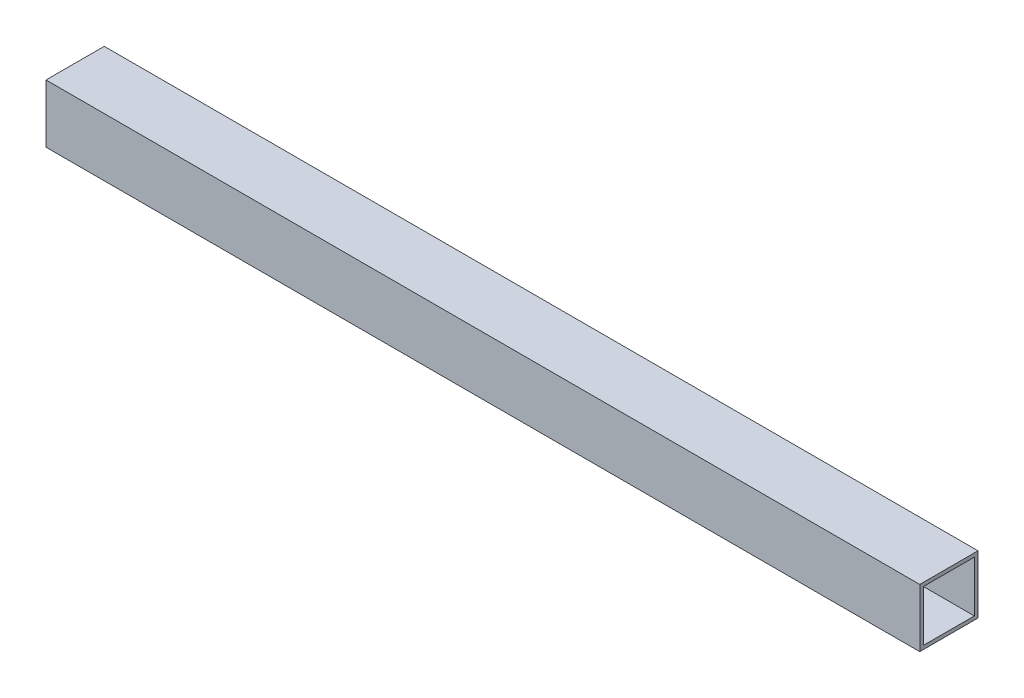
ISO-10303-21;
HEADER;
FILE_DESCRIPTION(('STEP AP214'),'2;1');
FILE_NAME('part.step','',(''),(''),'','','');
FILE_SCHEMA(('AUTOMOTIVE_DESIGN { 1 0 10303 214 1 1 1 1 }'));
ENDSEC;
DATA;
#1=APPLICATION_CONTEXT('core data for automotive mechanical design processes');
#2=APPLICATION_PROTOCOL_DEFINITION('international standard','automotive_design',2000,#1);
#3=PRODUCT_CONTEXT('',#1,'mechanical');
#4=PRODUCT('Part','Part','',(#3));
#5=PRODUCT_RELATED_PRODUCT_CATEGORY('part','',(#4));
#6=PRODUCT_DEFINITION_FORMATION('','',#4);
#7=PRODUCT_DEFINITION_CONTEXT('part definition',#1,'design');
#8=PRODUCT_DEFINITION('design','',#6,#7);
#9=PRODUCT_DEFINITION_SHAPE('','',#8);
#10=(LENGTH_UNIT() NAMED_UNIT(*) SI_UNIT(.MILLI.,.METRE.));
#11=(NAMED_UNIT(*) PLANE_ANGLE_UNIT() SI_UNIT($,.RADIAN.));
#12=(NAMED_UNIT(*) SI_UNIT($,.STERADIAN.) SOLID_ANGLE_UNIT());
#13=UNCERTAINTY_MEASURE_WITH_UNIT(LENGTH_MEASURE(1.E-05),#10,'distance_accuracy_value','');
#14=(GEOMETRIC_REPRESENTATION_CONTEXT(3) GLOBAL_UNCERTAINTY_ASSIGNED_CONTEXT((#13)) GLOBAL_UNIT_ASSIGNED_CONTEXT((#10,
#11,#12)) REPRESENTATION_CONTEXT('',''));
#15=CARTESIAN_POINT('',(0.,0.,0.));
#16=DIRECTION('',(0.,0.,1.));
#17=DIRECTION('',(1.,0.,0.));
#18=AXIS2_PLACEMENT_3D('',#15,#16,#17);
#19=CARTESIAN_POINT('',(381.,0.,0.));
#20=DIRECTION('',(1.,0.,0.));
#21=DIRECTION('',(0.,0.,-1.));
#22=AXIS2_PLACEMENT_3D('',#19,#20,#21);
#23=PLANE('',#22);
#24=DIRECTION('',(0.,1.,0.));
#25=VECTOR('',#24,1.);
#26=CARTESIAN_POINT('',(381.,-12.7,-12.7));
#27=LINE('',#26,#25);
#28=CARTESIAN_POINT('',(381.,-12.7,-12.7));
#29=VERTEX_POINT('',#28);
#30=CARTESIAN_POINT('',(381.,12.7,-12.7));
#31=VERTEX_POINT('',#30);
#32=EDGE_CURVE('E166',#29,#31,#27,.T.);
#33=ORIENTED_EDGE('',*,*,#32,.T.);
#34=DIRECTION('',(0.,0.,1.));
#35=VECTOR('',#34,1.);
#36=CARTESIAN_POINT('',(381.,12.7,12.7));
#37=LINE('',#36,#35);
#38=CARTESIAN_POINT('',(381.,12.7,12.7));
#39=VERTEX_POINT('',#38);
#40=EDGE_CURVE('E169',#31,#39,#37,.T.);
#41=ORIENTED_EDGE('',*,*,#40,.T.);
#42=DIRECTION('',(0.,-1.,0.));
#43=VECTOR('',#42,1.);
#44=CARTESIAN_POINT('',(381.,-12.7,12.7));
#45=LINE('',#44,#43);
#46=CARTESIAN_POINT('',(381.,-12.7,12.7));
#47=VERTEX_POINT('',#46);
#48=EDGE_CURVE('E172',#39,#47,#45,.T.);
#49=ORIENTED_EDGE('',*,*,#48,.T.);
#50=DIRECTION('',(0.,0.,-1.));
#51=VECTOR('',#50,1.);
#52=CARTESIAN_POINT('',(381.,-12.7,12.7));
#53=LINE('',#52,#51);
#54=EDGE_CURVE('E174',#47,#29,#53,.T.);
#55=ORIENTED_EDGE('',*,*,#54,.T.);
#56=EDGE_LOOP('',(#33,#41,#49,#55));
#57=FACE_BOUND('',#56,.T.);
#58=DIRECTION('',(0.,0.,1.));
#59=VECTOR('',#58,1.);
#60=CARTESIAN_POINT('',(381.,11.1125,0.));
#61=LINE('',#60,#59);
#62=CARTESIAN_POINT('',(381.,11.1125,-11.1125));
#63=VERTEX_POINT('',#62);
#64=CARTESIAN_POINT('',(381.,11.1125,11.1125));
#65=VERTEX_POINT('',#64);
#66=EDGE_CURVE('E138',#63,#65,#61,.T.);
#67=ORIENTED_EDGE('',*,*,#66,.F.);
#68=DIRECTION('',(0.,1.,0.));
#69=VECTOR('',#68,1.);
#70=CARTESIAN_POINT('',(381.,0.,-11.1125));
#71=LINE('',#70,#69);
#72=CARTESIAN_POINT('',(381.,-11.1125,-11.1125));
#73=VERTEX_POINT('',#72);
#74=EDGE_CURVE('E130',#73,#63,#71,.T.);
#75=ORIENTED_EDGE('',*,*,#74,.F.);
#76=DIRECTION('',(0.,0.,-1.));
#77=VECTOR('',#76,1.);
#78=CARTESIAN_POINT('',(381.,-11.1125,0.));
#79=LINE('',#78,#77);
#80=CARTESIAN_POINT('',(381.,-11.1125,11.1125));
#81=VERTEX_POINT('',#80);
#82=EDGE_CURVE('E152',#81,#73,#79,.T.);
#83=ORIENTED_EDGE('',*,*,#82,.F.);
#84=DIRECTION('',(0.,-1.,0.));
#85=VECTOR('',#84,1.);
#86=CARTESIAN_POINT('',(381.,0.,11.1125));
#87=LINE('',#86,#85);
#88=EDGE_CURVE('E150',#65,#81,#87,.T.);
#89=ORIENTED_EDGE('',*,*,#88,.F.);
#90=EDGE_LOOP('',(#67,#75,#83,#89));
#91=FACE_BOUND('',#90,.T.);
#92=ADVANCED_FACE('F65',(#57,#91),#23,.T.);
#93=CARTESIAN_POINT('',(0.,0.,0.));
#94=DIRECTION('',(1.,0.,0.));
#95=DIRECTION('',(0.,0.,-1.));
#96=AXIS2_PLACEMENT_3D('',#93,#94,#95);
#97=PLANE('',#96);
#98=DIRECTION('',(0.,1.,0.));
#99=VECTOR('',#98,1.);
#100=CARTESIAN_POINT('',(0.,-12.7,-12.7));
#101=LINE('',#100,#99);
#102=CARTESIAN_POINT('',(0.,-12.7,-12.7));
#103=VERTEX_POINT('',#102);
#104=CARTESIAN_POINT('',(0.,12.7,-12.7));
#105=VERTEX_POINT('',#104);
#106=EDGE_CURVE('E146',#103,#105,#101,.T.);
#107=ORIENTED_EDGE('',*,*,#106,.F.);
#108=DIRECTION('',(0.,0.,-1.));
#109=VECTOR('',#108,1.);
#110=CARTESIAN_POINT('',(0.,-12.7,12.7));
#111=LINE('',#110,#109);
#112=CARTESIAN_POINT('',(0.,-12.7,12.7));
#113=VERTEX_POINT('',#112);
#114=EDGE_CURVE('E170',#113,#103,#111,.T.);
#115=ORIENTED_EDGE('',*,*,#114,.F.);
#116=DIRECTION('',(0.,-1.,0.));
#117=VECTOR('',#116,1.);
#118=CARTESIAN_POINT('',(0.,-12.7,12.7));
#119=LINE('',#118,#117);
#120=CARTESIAN_POINT('',(0.,12.7,12.7));
#121=VERTEX_POINT('',#120);
#122=EDGE_CURVE('E181',#121,#113,#119,.T.);
#123=ORIENTED_EDGE('',*,*,#122,.F.);
#124=DIRECTION('',(0.,0.,1.));
#125=VECTOR('',#124,1.);
#126=CARTESIAN_POINT('',(0.,12.7,12.7));
#127=LINE('',#126,#125);
#128=EDGE_CURVE('E179',#105,#121,#127,.T.);
#129=ORIENTED_EDGE('',*,*,#128,.F.);
#130=EDGE_LOOP('',(#107,#115,#123,#129));
#131=FACE_BOUND('',#130,.T.);
#132=DIRECTION('',(0.,1.,0.));
#133=VECTOR('',#132,1.);
#134=CARTESIAN_POINT('',(0.,0.,-11.1125));
#135=LINE('',#134,#133);
#136=CARTESIAN_POINT('',(0.,-11.1125,-11.1125));
#137=VERTEX_POINT('',#136);
#138=CARTESIAN_POINT('',(0.,11.1125,-11.1125));
#139=VERTEX_POINT('',#138);
#140=EDGE_CURVE('E88',#137,#139,#135,.T.);
#141=ORIENTED_EDGE('',*,*,#140,.T.);
#142=DIRECTION('',(0.,0.,1.));
#143=VECTOR('',#142,1.);
#144=CARTESIAN_POINT('',(0.,11.1125,0.));
#145=LINE('',#144,#143);
#146=CARTESIAN_POINT('',(0.,11.1125,11.1125));
#147=VERTEX_POINT('',#146);
#148=EDGE_CURVE('E145',#139,#147,#145,.T.);
#149=ORIENTED_EDGE('',*,*,#148,.T.);
#150=DIRECTION('',(0.,-1.,0.));
#151=VECTOR('',#150,1.);
#152=CARTESIAN_POINT('',(0.,0.,11.1125));
#153=LINE('',#152,#151);
#154=CARTESIAN_POINT('',(0.,-11.1125,11.1125));
#155=VERTEX_POINT('',#154);
#156=EDGE_CURVE('E158',#147,#155,#153,.T.);
#157=ORIENTED_EDGE('',*,*,#156,.T.);
#158=DIRECTION('',(0.,0.,-1.));
#159=VECTOR('',#158,1.);
#160=CARTESIAN_POINT('',(0.,-11.1125,0.));
#161=LINE('',#160,#159);
#162=EDGE_CURVE('E139',#155,#137,#161,.T.);
#163=ORIENTED_EDGE('',*,*,#162,.T.);
#164=EDGE_LOOP('',(#141,#149,#157,#163));
#165=FACE_BOUND('',#164,.T.);
#166=ADVANCED_FACE('F199',(#131,#165),#97,.F.);
#167=CARTESIAN_POINT('',(381.,-12.7,-12.7));
#168=DIRECTION('',(0.,0.,1.));
#169=DIRECTION('',(1.,0.,0.));
#170=AXIS2_PLACEMENT_3D('',#167,#168,#169);
#171=PLANE('',#170);
#172=ORIENTED_EDGE('',*,*,#106,.T.);
#173=DIRECTION('',(-1.,0.,0.));
#174=VECTOR('',#173,1.);
#175=CARTESIAN_POINT('',(381.,12.7,-12.7));
#176=LINE('',#175,#174);
#177=EDGE_CURVE('E12',#31,#105,#176,.T.);
#178=ORIENTED_EDGE('',*,*,#177,.F.);
#179=ORIENTED_EDGE('',*,*,#32,.F.);
#180=DIRECTION('',(-1.,0.,0.));
#181=VECTOR('',#180,1.);
#182=CARTESIAN_POINT('',(381.,-12.7,-12.7));
#183=LINE('',#182,#181);
#184=EDGE_CURVE('E176',#29,#103,#183,.T.);
#185=ORIENTED_EDGE('',*,*,#184,.T.);
#186=EDGE_LOOP('',(#172,#178,#179,#185));
#187=FACE_BOUND('',#186,.T.);
#188=ADVANCED_FACE('F67',(#187),#171,.F.);
#189=CARTESIAN_POINT('',(381.,12.7,12.7));
#190=DIRECTION('',(0.,-1.,0.));
#191=DIRECTION('',(0.,0.,-1.));
#192=AXIS2_PLACEMENT_3D('',#189,#190,#191);
#193=PLANE('',#192);
#194=ORIENTED_EDGE('',*,*,#128,.T.);
#195=DIRECTION('',(-1.,0.,0.));
#196=VECTOR('',#195,1.);
#197=CARTESIAN_POINT('',(381.,12.7,12.7));
#198=LINE('',#197,#196);
#199=EDGE_CURVE('E73',#39,#121,#198,.T.);
#200=ORIENTED_EDGE('',*,*,#199,.F.);
#201=ORIENTED_EDGE('',*,*,#40,.F.);
#202=ORIENTED_EDGE('',*,*,#177,.T.);
#203=EDGE_LOOP('',(#194,#200,#201,#202));
#204=FACE_BOUND('',#203,.T.);
#205=ADVANCED_FACE('F209',(#204),#193,.F.);
#206=CARTESIAN_POINT('',(381.,-12.7,12.7));
#207=DIRECTION('',(0.,0.,-1.));
#208=DIRECTION('',(-1.,0.,0.));
#209=AXIS2_PLACEMENT_3D('',#206,#207,#208);
#210=PLANE('',#209);
#211=ORIENTED_EDGE('',*,*,#122,.T.);
#212=DIRECTION('',(-1.,0.,0.));
#213=VECTOR('',#212,1.);
#214=CARTESIAN_POINT('',(381.,-12.7,12.7));
#215=LINE('',#214,#213);
#216=EDGE_CURVE('E186',#47,#113,#215,.T.);
#217=ORIENTED_EDGE('',*,*,#216,.F.);
#218=ORIENTED_EDGE('',*,*,#48,.F.);
#219=ORIENTED_EDGE('',*,*,#199,.T.);
#220=EDGE_LOOP('',(#211,#217,#218,#219));
#221=FACE_BOUND('',#220,.T.);
#222=ADVANCED_FACE('F193',(#221),#210,.F.);
#223=CARTESIAN_POINT('',(381.,-12.7,12.7));
#224=DIRECTION('',(0.,1.,0.));
#225=DIRECTION('',(0.,0.,1.));
#226=AXIS2_PLACEMENT_3D('',#223,#224,#225);
#227=PLANE('',#226);
#228=ORIENTED_EDGE('',*,*,#114,.T.);
#229=ORIENTED_EDGE('',*,*,#184,.F.);
#230=ORIENTED_EDGE('',*,*,#54,.F.);
#231=ORIENTED_EDGE('',*,*,#216,.T.);
#232=EDGE_LOOP('',(#228,#229,#230,#231));
#233=FACE_BOUND('',#232,.T.);
#234=ADVANCED_FACE('F203',(#233),#227,.F.);
#235=CARTESIAN_POINT('',(381.,0.,-11.1125));
#236=DIRECTION('',(0.,0.,1.));
#237=DIRECTION('',(1.,0.,0.));
#238=AXIS2_PLACEMENT_3D('',#235,#236,#237);
#239=PLANE('',#238);
#240=ORIENTED_EDGE('',*,*,#140,.F.);
#241=DIRECTION('',(-1.,0.,0.));
#242=VECTOR('',#241,1.);
#243=CARTESIAN_POINT('',(381.,-11.1125,-11.1125));
#244=LINE('',#243,#242);
#245=EDGE_CURVE('E134',#73,#137,#244,.T.);
#246=ORIENTED_EDGE('',*,*,#245,.F.);
#247=ORIENTED_EDGE('',*,*,#74,.T.);
#248=DIRECTION('',(-1.,0.,0.));
#249=VECTOR('',#248,1.);
#250=CARTESIAN_POINT('',(381.,11.1125,-11.1125));
#251=LINE('',#250,#249);
#252=EDGE_CURVE('E133',#63,#139,#251,.T.);
#253=ORIENTED_EDGE('',*,*,#252,.T.);
#254=EDGE_LOOP('',(#240,#246,#247,#253));
#255=FACE_BOUND('',#254,.T.);
#256=ADVANCED_FACE('F132',(#255),#239,.T.);
#257=CARTESIAN_POINT('',(381.,11.1125,0.));
#258=DIRECTION('',(0.,-1.,0.));
#259=DIRECTION('',(0.,0.,-1.));
#260=AXIS2_PLACEMENT_3D('',#257,#258,#259);
#261=PLANE('',#260);
#262=ORIENTED_EDGE('',*,*,#148,.F.);
#263=ORIENTED_EDGE('',*,*,#252,.F.);
#264=ORIENTED_EDGE('',*,*,#66,.T.);
#265=DIRECTION('',(-1.,0.,0.));
#266=VECTOR('',#265,1.);
#267=CARTESIAN_POINT('',(381.,11.1125,11.1125));
#268=LINE('',#267,#266);
#269=EDGE_CURVE('E147',#65,#147,#268,.T.);
#270=ORIENTED_EDGE('',*,*,#269,.T.);
#271=EDGE_LOOP('',(#262,#263,#264,#270));
#272=FACE_BOUND('',#271,.T.);
#273=ADVANCED_FACE('F142',(#272),#261,.T.);
#274=CARTESIAN_POINT('',(381.,0.,11.1125));
#275=DIRECTION('',(0.,0.,-1.));
#276=DIRECTION('',(-1.,0.,0.));
#277=AXIS2_PLACEMENT_3D('',#274,#275,#276);
#278=PLANE('',#277);
#279=ORIENTED_EDGE('',*,*,#156,.F.);
#280=ORIENTED_EDGE('',*,*,#269,.F.);
#281=ORIENTED_EDGE('',*,*,#88,.T.);
#282=DIRECTION('',(-1.,0.,0.));
#283=VECTOR('',#282,1.);
#284=CARTESIAN_POINT('',(381.,-11.1125,11.1125));
#285=LINE('',#284,#283);
#286=EDGE_CURVE('E80',#81,#155,#285,.T.);
#287=ORIENTED_EDGE('',*,*,#286,.T.);
#288=EDGE_LOOP('',(#279,#280,#281,#287));
#289=FACE_BOUND('',#288,.T.);
#290=ADVANCED_FACE('F232',(#289),#278,.T.);
#291=CARTESIAN_POINT('',(381.,-11.1125,0.));
#292=DIRECTION('',(0.,1.,0.));
#293=DIRECTION('',(0.,0.,1.));
#294=AXIS2_PLACEMENT_3D('',#291,#292,#293);
#295=PLANE('',#294);
#296=ORIENTED_EDGE('',*,*,#162,.F.);
#297=ORIENTED_EDGE('',*,*,#286,.F.);
#298=ORIENTED_EDGE('',*,*,#82,.T.);
#299=ORIENTED_EDGE('',*,*,#245,.T.);
#300=EDGE_LOOP('',(#296,#297,#298,#299));
#301=FACE_BOUND('',#300,.T.);
#302=ADVANCED_FACE('F236',(#301),#295,.T.);
#303=CLOSED_SHELL('',(#92,#166,#188,#205,#222,#234,#256,#273,#290,#302));
#304=MANIFOLD_SOLID_BREP('B2',#303);
#305=ADVANCED_BREP_SHAPE_REPRESENTATION('',(#18,#304),#14);
#306=SHAPE_DEFINITION_REPRESENTATION(#9,#305);
ENDSEC;
END-ISO-10303-21;
